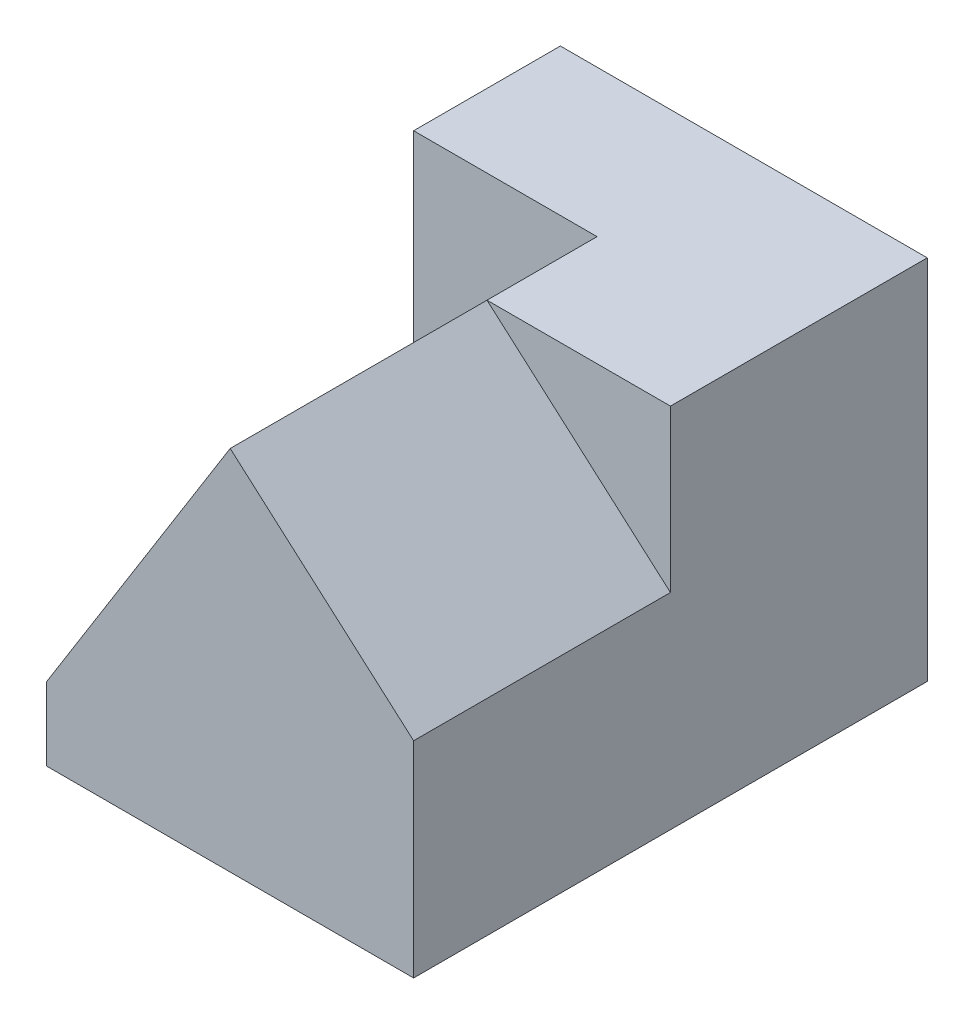
ISO-10303-21;
HEADER;
FILE_DESCRIPTION(('STEP AP214'),'2;1');
FILE_NAME('part.step','',(''),(''),'','','');
FILE_SCHEMA(('AUTOMOTIVE_DESIGN { 1 0 10303 214 1 1 1 1 }'));
ENDSEC;
DATA;
#1=APPLICATION_CONTEXT('core data for automotive mechanical design processes');
#2=APPLICATION_PROTOCOL_DEFINITION('international standard','automotive_design',2000,#1);
#3=PRODUCT_CONTEXT('',#1,'mechanical');
#4=PRODUCT('Part','Part','',(#3));
#5=PRODUCT_RELATED_PRODUCT_CATEGORY('part','',(#4));
#6=PRODUCT_DEFINITION_FORMATION('','',#4);
#7=PRODUCT_DEFINITION_CONTEXT('part definition',#1,'design');
#8=PRODUCT_DEFINITION('design','',#6,#7);
#9=PRODUCT_DEFINITION_SHAPE('','',#8);
#10=(LENGTH_UNIT() NAMED_UNIT(*) SI_UNIT(.MILLI.,.METRE.));
#11=(NAMED_UNIT(*) PLANE_ANGLE_UNIT() SI_UNIT($,.RADIAN.));
#12=(NAMED_UNIT(*) SI_UNIT($,.STERADIAN.) SOLID_ANGLE_UNIT());
#13=UNCERTAINTY_MEASURE_WITH_UNIT(LENGTH_MEASURE(1.E-05),#10,'distance_accuracy_value','');
#14=(GEOMETRIC_REPRESENTATION_CONTEXT(3) GLOBAL_UNCERTAINTY_ASSIGNED_CONTEXT((#13)) GLOBAL_UNIT_ASSIGNED_CONTEXT((#10,
#11,#12)) REPRESENTATION_CONTEXT('',''));
#15=CARTESIAN_POINT('',(0.,0.,0.));
#16=DIRECTION('',(0.,0.,1.));
#17=DIRECTION('',(1.,0.,0.));
#18=AXIS2_PLACEMENT_3D('',#15,#16,#17);
#19=CARTESIAN_POINT('',(-25.,10.,70.));
#20=DIRECTION('',(1.,0.,0.));
#21=DIRECTION('',(0.,0.,-1.));
#22=AXIS2_PLACEMENT_3D('',#19,#20,#21);
#23=PLANE('',#22);
#24=DIRECTION('',(0.,0.,-1.));
#25=VECTOR('',#24,1.);
#26=CARTESIAN_POINT('',(-25.,10.,70.));
#27=LINE('',#26,#25);
#28=CARTESIAN_POINT('',(-25.,10.,70.));
#29=VERTEX_POINT('',#28);
#30=CARTESIAN_POINT('',(-25.,10.,20.));
#31=VERTEX_POINT('',#30);
#32=EDGE_CURVE('E105',#29,#31,#27,.T.);
#33=ORIENTED_EDGE('',*,*,#32,.T.);
#34=DIRECTION('',(0.,1.,0.));
#35=VECTOR('',#34,1.);
#36=CARTESIAN_POINT('',(-25.,-61.0327780786685,20.));
#37=LINE('',#36,#35);
#38=CARTESIAN_POINT('',(-25.,50.,20.));
#39=VERTEX_POINT('',#38);
#40=EDGE_CURVE('E113',#31,#39,#37,.T.);
#41=ORIENTED_EDGE('',*,*,#40,.T.);
#42=DIRECTION('',(0.,0.,1.));
#43=VECTOR('',#42,1.);
#44=CARTESIAN_POINT('',(-25.,50.,0.));
#45=LINE('',#44,#43);
#46=CARTESIAN_POINT('',(-25.,50.,0.));
#47=VERTEX_POINT('',#46);
#48=EDGE_CURVE('E142',#47,#39,#45,.T.);
#49=ORIENTED_EDGE('',*,*,#48,.F.);
#50=DIRECTION('',(0.,-1.,0.));
#51=VECTOR('',#50,1.);
#52=CARTESIAN_POINT('',(-25.,10.,0.));
#53=LINE('',#52,#51);
#54=CARTESIAN_POINT('',(-25.,0.,0.));
#55=VERTEX_POINT('',#54);
#56=EDGE_CURVE('E109',#47,#55,#53,.T.);
#57=ORIENTED_EDGE('',*,*,#56,.T.);
#58=DIRECTION('',(0.,0.,-1.));
#59=VECTOR('',#58,1.);
#60=CARTESIAN_POINT('',(-25.,0.,70.));
#61=LINE('',#60,#59);
#62=CARTESIAN_POINT('',(-25.,0.,70.));
#63=VERTEX_POINT('',#62);
#64=EDGE_CURVE('E122',#63,#55,#61,.T.);
#65=ORIENTED_EDGE('',*,*,#64,.F.);
#66=DIRECTION('',(0.,-1.,0.));
#67=VECTOR('',#66,1.);
#68=CARTESIAN_POINT('',(-25.,10.,70.));
#69=LINE('',#68,#67);
#70=EDGE_CURVE('E117',#29,#63,#69,.T.);
#71=ORIENTED_EDGE('',*,*,#70,.F.);
#72=EDGE_LOOP('',(#33,#41,#49,#57,#65,#71));
#73=FACE_BOUND('',#72,.T.);
#74=ADVANCED_FACE('F33',(#73),#23,.F.);
#75=CARTESIAN_POINT('',(-25.,0.,70.));
#76=DIRECTION('',(0.,1.,0.));
#77=DIRECTION('',(0.,0.,1.));
#78=AXIS2_PLACEMENT_3D('',#75,#76,#77);
#79=PLANE('',#78);
#80=DIRECTION('',(1.,0.,0.));
#81=VECTOR('',#80,1.);
#82=CARTESIAN_POINT('',(-25.,0.,0.));
#83=LINE('',#82,#81);
#84=CARTESIAN_POINT('',(25.,0.,0.));
#85=VERTEX_POINT('',#84);
#86=EDGE_CURVE('E112',#55,#85,#83,.T.);
#87=ORIENTED_EDGE('',*,*,#86,.T.);
#88=DIRECTION('',(0.,0.,-1.));
#89=VECTOR('',#88,1.);
#90=CARTESIAN_POINT('',(25.,0.,70.));
#91=LINE('',#90,#89);
#92=CARTESIAN_POINT('',(25.,0.,70.));
#93=VERTEX_POINT('',#92);
#94=EDGE_CURVE('E72',#93,#85,#91,.T.);
#95=ORIENTED_EDGE('',*,*,#94,.F.);
#96=DIRECTION('',(1.,0.,0.));
#97=VECTOR('',#96,1.);
#98=CARTESIAN_POINT('',(-25.,0.,70.));
#99=LINE('',#98,#97);
#100=EDGE_CURVE('E79',#63,#93,#99,.T.);
#101=ORIENTED_EDGE('',*,*,#100,.F.);
#102=ORIENTED_EDGE('',*,*,#64,.T.);
#103=EDGE_LOOP('',(#87,#95,#101,#102));
#104=FACE_BOUND('',#103,.T.);
#105=ADVANCED_FACE('F172',(#104),#79,.F.);
#106=CARTESIAN_POINT('',(25.,0.,70.));
#107=DIRECTION('',(-1.,0.,0.));
#108=DIRECTION('',(0.,0.,1.));
#109=AXIS2_PLACEMENT_3D('',#106,#107,#108);
#110=PLANE('',#109);
#111=ORIENTED_EDGE('',*,*,#94,.T.);
#112=DIRECTION('',(0.,1.,0.));
#113=VECTOR('',#112,1.);
#114=CARTESIAN_POINT('',(25.,0.,0.));
#115=LINE('',#114,#113);
#116=CARTESIAN_POINT('',(25.,50.,0.));
#117=VERTEX_POINT('',#116);
#118=EDGE_CURVE('E115',#85,#117,#115,.T.);
#119=ORIENTED_EDGE('',*,*,#118,.T.);
#120=DIRECTION('',(0.,0.,-1.));
#121=VECTOR('',#120,1.);
#122=CARTESIAN_POINT('',(25.,50.,35.));
#123=LINE('',#122,#121);
#124=CARTESIAN_POINT('',(25.,50.,35.));
#125=VERTEX_POINT('',#124);
#126=EDGE_CURVE('E147',#125,#117,#123,.T.);
#127=ORIENTED_EDGE('',*,*,#126,.F.);
#128=DIRECTION('',(0.,1.,0.));
#129=VECTOR('',#128,1.);
#130=CARTESIAN_POINT('',(25.,-61.0327780786685,35.));
#131=LINE('',#130,#129);
#132=CARTESIAN_POINT('',(25.,28.,35.));
#133=VERTEX_POINT('',#132);
#134=EDGE_CURVE('E98',#133,#125,#131,.T.);
#135=ORIENTED_EDGE('',*,*,#134,.F.);
#136=DIRECTION('',(0.,0.,-1.));
#137=VECTOR('',#136,1.);
#138=CARTESIAN_POINT('',(25.,28.,70.));
#139=LINE('',#138,#137);
#140=CARTESIAN_POINT('',(25.,28.,70.));
#141=VERTEX_POINT('',#140);
#142=EDGE_CURVE('E93',#141,#133,#139,.T.);
#143=ORIENTED_EDGE('',*,*,#142,.F.);
#144=DIRECTION('',(0.,1.,0.));
#145=VECTOR('',#144,1.);
#146=CARTESIAN_POINT('',(25.,0.,70.));
#147=LINE('',#146,#145);
#148=EDGE_CURVE('E84',#93,#141,#147,.T.);
#149=ORIENTED_EDGE('',*,*,#148,.F.);
#150=EDGE_LOOP('',(#111,#119,#127,#135,#143,#149));
#151=FACE_BOUND('',#150,.T.);
#152=ADVANCED_FACE('F94',(#151),#110,.F.);
#153=CARTESIAN_POINT('',(25.,28.,70.));
#154=DIRECTION('',(-0.660627894892025,-0.750713516922755,0.));
#155=DIRECTION('',(0.750713516922755,-0.660627894892025,0.));
#156=AXIS2_PLACEMENT_3D('',#153,#154,#155);
#157=PLANE('',#156);
#158=ORIENTED_EDGE('',*,*,#142,.T.);
#159=DIRECTION('',(-0.750713516922755,0.660627894892025,0.));
#160=VECTOR('',#159,1.);
#161=CARTESIAN_POINT('',(25.,28.,35.));
#162=LINE('',#161,#160);
#163=CARTESIAN_POINT('',(0.,50.,35.));
#164=VERTEX_POINT('',#163);
#165=EDGE_CURVE('E11',#133,#164,#162,.T.);
#166=ORIENTED_EDGE('',*,*,#165,.T.);
#167=DIRECTION('',(0.,0.,-1.));
#168=VECTOR('',#167,1.);
#169=CARTESIAN_POINT('',(0.,50.,70.));
#170=LINE('',#169,#168);
#171=CARTESIAN_POINT('',(0.,50.,70.));
#172=VERTEX_POINT('',#171);
#173=EDGE_CURVE('E100',#172,#164,#170,.T.);
#174=ORIENTED_EDGE('',*,*,#173,.F.);
#175=DIRECTION('',(-0.750713516922755,0.660627894892025,0.));
#176=VECTOR('',#175,1.);
#177=CARTESIAN_POINT('',(25.,28.,70.));
#178=LINE('',#177,#176);
#179=EDGE_CURVE('E88',#141,#172,#178,.T.);
#180=ORIENTED_EDGE('',*,*,#179,.F.);
#181=EDGE_LOOP('',(#158,#166,#174,#180));
#182=FACE_BOUND('',#181,.T.);
#183=ADVANCED_FACE('F102',(#182),#157,.F.);
#184=CARTESIAN_POINT('',(0.,50.,70.));
#185=DIRECTION('',(0.847998304005088,-0.52999894000318,0.));
#186=DIRECTION('',(0.52999894000318,0.847998304005088,0.));
#187=AXIS2_PLACEMENT_3D('',#184,#185,#186);
#188=PLANE('',#187);
#189=DIRECTION('',(0.,0.,1.));
#190=VECTOR('',#189,1.);
#191=CARTESIAN_POINT('',(0.,50.,20.));
#192=LINE('',#191,#190);
#193=CARTESIAN_POINT('',(0.,50.,20.));
#194=VERTEX_POINT('',#193);
#195=EDGE_CURVE('E128',#194,#164,#192,.T.);
#196=ORIENTED_EDGE('',*,*,#195,.F.);
#197=DIRECTION('',(-0.52999894000318,-0.847998304005088,0.));
#198=VECTOR('',#197,1.);
#199=CARTESIAN_POINT('',(0.,50.,20.));
#200=LINE('',#199,#198);
#201=EDGE_CURVE('E40',#194,#31,#200,.T.);
#202=ORIENTED_EDGE('',*,*,#201,.T.);
#203=ORIENTED_EDGE('',*,*,#32,.F.);
#204=DIRECTION('',(-0.52999894000318,-0.847998304005088,0.));
#205=VECTOR('',#204,1.);
#206=CARTESIAN_POINT('',(0.,50.,70.));
#207=LINE('',#206,#205);
#208=EDGE_CURVE('E56',#172,#29,#207,.T.);
#209=ORIENTED_EDGE('',*,*,#208,.F.);
#210=ORIENTED_EDGE('',*,*,#173,.T.);
#211=EDGE_LOOP('',(#196,#202,#203,#209,#210));
#212=FACE_BOUND('',#211,.T.);
#213=ADVANCED_FACE('F126',(#212),#188,.F.);
#214=CARTESIAN_POINT('',(0.,0.,70.));
#215=DIRECTION('',(0.,0.,1.));
#216=DIRECTION('',(1.,0.,0.));
#217=AXIS2_PLACEMENT_3D('',#214,#215,#216);
#218=PLANE('',#217);
#219=ORIENTED_EDGE('',*,*,#70,.T.);
#220=ORIENTED_EDGE('',*,*,#100,.T.);
#221=ORIENTED_EDGE('',*,*,#148,.T.);
#222=ORIENTED_EDGE('',*,*,#179,.T.);
#223=ORIENTED_EDGE('',*,*,#208,.T.);
#224=EDGE_LOOP('',(#219,#220,#221,#222,#223));
#225=FACE_BOUND('',#224,.T.);
#226=ADVANCED_FACE('F86',(#225),#218,.T.);
#227=CARTESIAN_POINT('',(0.,0.,0.));
#228=DIRECTION('',(0.,0.,1.));
#229=DIRECTION('',(1.,0.,0.));
#230=AXIS2_PLACEMENT_3D('',#227,#228,#229);
#231=PLANE('',#230);
#232=ORIENTED_EDGE('',*,*,#56,.F.);
#233=DIRECTION('',(-1.,0.,0.));
#234=VECTOR('',#233,1.);
#235=CARTESIAN_POINT('',(25.,50.,0.));
#236=LINE('',#235,#234);
#237=EDGE_CURVE('E144',#117,#47,#236,.T.);
#238=ORIENTED_EDGE('',*,*,#237,.F.);
#239=ORIENTED_EDGE('',*,*,#118,.F.);
#240=ORIENTED_EDGE('',*,*,#86,.F.);
#241=EDGE_LOOP('',(#232,#238,#239,#240));
#242=FACE_BOUND('',#241,.T.);
#243=ADVANCED_FACE('F170',(#242),#231,.F.);
#244=CARTESIAN_POINT('',(0.,-61.0327780786685,35.));
#245=DIRECTION('',(0.,0.,1.));
#246=DIRECTION('',(1.,0.,0.));
#247=AXIS2_PLACEMENT_3D('',#244,#245,#246);
#248=PLANE('',#247);
#249=ORIENTED_EDGE('',*,*,#165,.F.);
#250=ORIENTED_EDGE('',*,*,#134,.T.);
#251=DIRECTION('',(1.,0.,0.));
#252=VECTOR('',#251,1.);
#253=CARTESIAN_POINT('',(0.,50.,35.));
#254=LINE('',#253,#252);
#255=EDGE_CURVE('E150',#164,#125,#254,.T.);
#256=ORIENTED_EDGE('',*,*,#255,.F.);
#257=EDGE_LOOP('',(#249,#250,#256));
#258=FACE_BOUND('',#257,.T.);
#259=ADVANCED_FACE('F160',(#258),#248,.T.);
#260=CARTESIAN_POINT('',(-25.,-61.0327780786685,20.));
#261=DIRECTION('',(0.,0.,1.));
#262=DIRECTION('',(1.,0.,0.));
#263=AXIS2_PLACEMENT_3D('',#260,#261,#262);
#264=PLANE('',#263);
#265=ORIENTED_EDGE('',*,*,#201,.F.);
#266=DIRECTION('',(1.,0.,0.));
#267=VECTOR('',#266,1.);
#268=CARTESIAN_POINT('',(-25.,50.,20.));
#269=LINE('',#268,#267);
#270=EDGE_CURVE('E47',#39,#194,#269,.T.);
#271=ORIENTED_EDGE('',*,*,#270,.F.);
#272=ORIENTED_EDGE('',*,*,#40,.F.);
#273=EDGE_LOOP('',(#265,#271,#272));
#274=FACE_BOUND('',#273,.T.);
#275=ADVANCED_FACE('F190',(#274),#264,.T.);
#276=CARTESIAN_POINT('',(0.,50.,0.));
#277=DIRECTION('',(0.,1.,0.));
#278=DIRECTION('',(0.,0.,1.));
#279=AXIS2_PLACEMENT_3D('',#276,#277,#278);
#280=PLANE('',#279);
#281=ORIENTED_EDGE('',*,*,#270,.T.);
#282=ORIENTED_EDGE('',*,*,#195,.T.);
#283=ORIENTED_EDGE('',*,*,#255,.T.);
#284=ORIENTED_EDGE('',*,*,#126,.T.);
#285=ORIENTED_EDGE('',*,*,#237,.T.);
#286=ORIENTED_EDGE('',*,*,#48,.T.);
#287=EDGE_LOOP('',(#281,#282,#283,#284,#285,#286));
#288=FACE_BOUND('',#287,.T.);
#289=ADVANCED_FACE('F154',(#288),#280,.T.);
#290=CLOSED_SHELL('',(#74,#105,#152,#183,#213,#226,#243,#259,#275,#289));
#291=MANIFOLD_SOLID_BREP('B2',#290);
#292=ADVANCED_BREP_SHAPE_REPRESENTATION('',(#18,#291),#14);
#293=SHAPE_DEFINITION_REPRESENTATION(#9,#292);
ENDSEC;
END-ISO-10303-21;
